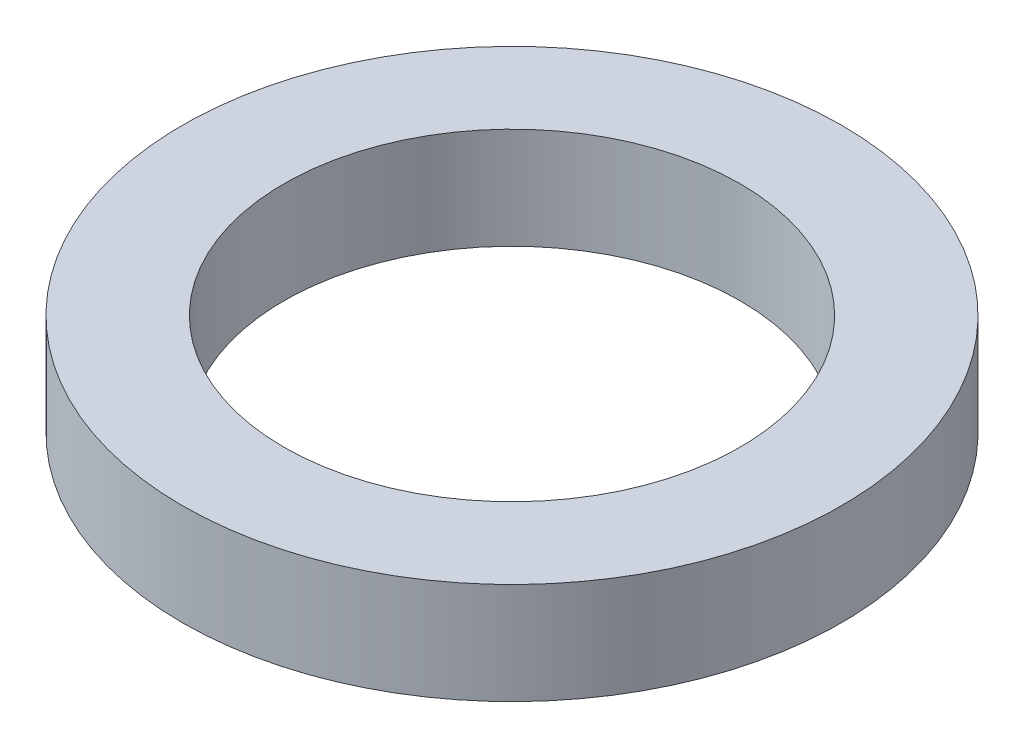
ISO-10303-21;
HEADER;
FILE_DESCRIPTION(('STEP AP214'),'2;1');
FILE_NAME('part.step','',(''),(''),'','','');
FILE_SCHEMA(('AUTOMOTIVE_DESIGN { 1 0 10303 214 1 1 1 1 }'));
ENDSEC;
DATA;
#1=APPLICATION_CONTEXT('core data for automotive mechanical design processes');
#2=APPLICATION_PROTOCOL_DEFINITION('international standard','automotive_design',2000,#1);
#3=PRODUCT_CONTEXT('',#1,'mechanical');
#4=PRODUCT('Part','Part','',(#3));
#5=PRODUCT_RELATED_PRODUCT_CATEGORY('part','',(#4));
#6=PRODUCT_DEFINITION_FORMATION('','',#4);
#7=PRODUCT_DEFINITION_CONTEXT('part definition',#1,'design');
#8=PRODUCT_DEFINITION('design','',#6,#7);
#9=PRODUCT_DEFINITION_SHAPE('','',#8);
#10=(LENGTH_UNIT() NAMED_UNIT(*) SI_UNIT(.MILLI.,.METRE.));
#11=(NAMED_UNIT(*) PLANE_ANGLE_UNIT() SI_UNIT($,.RADIAN.));
#12=(NAMED_UNIT(*) SI_UNIT($,.STERADIAN.) SOLID_ANGLE_UNIT());
#13=UNCERTAINTY_MEASURE_WITH_UNIT(LENGTH_MEASURE(1.E-05),#10,'distance_accuracy_value','');
#14=(GEOMETRIC_REPRESENTATION_CONTEXT(3) GLOBAL_UNCERTAINTY_ASSIGNED_CONTEXT((#13)) GLOBAL_UNIT_ASSIGNED_CONTEXT((#10,
#11,#12)) REPRESENTATION_CONTEXT('',''));
#15=CARTESIAN_POINT('',(0.,0.,0.));
#16=DIRECTION('',(0.,0.,1.));
#17=DIRECTION('',(1.,0.,0.));
#18=AXIS2_PLACEMENT_3D('',#15,#16,#17);
#19=CARTESIAN_POINT('',(0.,1.,0.));
#20=DIRECTION('',(0.,1.,0.));
#21=DIRECTION('',(0.,0.,1.));
#22=AXIS2_PLACEMENT_3D('',#19,#20,#21);
#23=PLANE('',#22);
#24=CARTESIAN_POINT('',(0.,1.,0.));
#25=DIRECTION('',(0.,1.,0.));
#26=DIRECTION('',(0.,0.,1.));
#27=AXIS2_PLACEMENT_3D('',#24,#25,#26);
#28=CIRCLE('',#27,3.25);
#29=CARTESIAN_POINT('',(0.,1.,3.25));
#30=VERTEX_POINT('',#29);
#31=EDGE_CURVE('E10',#30,#30,#28,.T.);
#32=ORIENTED_EDGE('',*,*,#31,.T.);
#33=EDGE_LOOP('',(#32));
#34=FACE_BOUND('',#33,.T.);
#35=CARTESIAN_POINT('',(0.,1.,0.));
#36=DIRECTION('',(0.,1.,0.));
#37=DIRECTION('',(0.,0.,1.));
#38=AXIS2_PLACEMENT_3D('',#35,#36,#37);
#39=CIRCLE('',#38,2.25);
#40=CARTESIAN_POINT('',(0.,1.,2.25));
#41=VERTEX_POINT('',#40);
#42=EDGE_CURVE('E52',#41,#41,#39,.T.);
#43=ORIENTED_EDGE('',*,*,#42,.F.);
#44=EDGE_LOOP('',(#43));
#45=FACE_BOUND('',#44,.T.);
#46=ADVANCED_FACE('F41',(#34,#45),#23,.T.);
#47=CARTESIAN_POINT('',(0.,0.,0.));
#48=DIRECTION('',(0.,1.,0.));
#49=DIRECTION('',(0.,0.,1.));
#50=AXIS2_PLACEMENT_3D('',#47,#48,#49);
#51=PLANE('',#50);
#52=CARTESIAN_POINT('',(0.,0.,0.));
#53=DIRECTION('',(0.,1.,0.));
#54=DIRECTION('',(0.,0.,1.));
#55=AXIS2_PLACEMENT_3D('',#52,#53,#54);
#56=CIRCLE('',#55,3.25);
#57=CARTESIAN_POINT('',(0.,0.,3.25));
#58=VERTEX_POINT('',#57);
#59=EDGE_CURVE('E45',#58,#58,#56,.T.);
#60=ORIENTED_EDGE('',*,*,#59,.F.);
#61=EDGE_LOOP('',(#60));
#62=FACE_BOUND('',#61,.T.);
#63=CARTESIAN_POINT('',(0.,0.,0.));
#64=DIRECTION('',(0.,1.,0.));
#65=DIRECTION('',(0.,0.,1.));
#66=AXIS2_PLACEMENT_3D('',#63,#64,#65);
#67=CIRCLE('',#66,2.25);
#68=CARTESIAN_POINT('',(0.,0.,2.25));
#69=VERTEX_POINT('',#68);
#70=EDGE_CURVE('E54',#69,#69,#67,.T.);
#71=ORIENTED_EDGE('',*,*,#70,.T.);
#72=EDGE_LOOP('',(#71));
#73=FACE_BOUND('',#72,.T.);
#74=ADVANCED_FACE('F64',(#62,#73),#51,.F.);
#75=CARTESIAN_POINT('',(0.,1.,0.));
#76=DIRECTION('',(0.,-1.,0.));
#77=DIRECTION('',(0.,0.,-1.));
#78=AXIS2_PLACEMENT_3D('',#75,#76,#77);
#79=CYLINDRICAL_SURFACE('',#78,3.25);
#80=ORIENTED_EDGE('',*,*,#31,.F.);
#81=EDGE_LOOP('',(#80));
#82=FACE_BOUND('',#81,.T.);
#83=ORIENTED_EDGE('',*,*,#59,.T.);
#84=EDGE_LOOP('',(#83));
#85=FACE_BOUND('',#84,.T.);
#86=ADVANCED_FACE('F43',(#82,#85),#79,.T.);
#87=CARTESIAN_POINT('',(0.,1.,0.));
#88=DIRECTION('',(0.,-1.,0.));
#89=DIRECTION('',(0.,0.,-1.));
#90=AXIS2_PLACEMENT_3D('',#87,#88,#89);
#91=CYLINDRICAL_SURFACE('',#90,2.25);
#92=ORIENTED_EDGE('',*,*,#42,.T.);
#93=EDGE_LOOP('',(#92));
#94=FACE_BOUND('',#93,.T.);
#95=ORIENTED_EDGE('',*,*,#70,.F.);
#96=EDGE_LOOP('',(#95));
#97=FACE_BOUND('',#96,.T.);
#98=ADVANCED_FACE('F60',(#94,#97),#91,.F.);
#99=CLOSED_SHELL('',(#46,#74,#86,#98));
#100=MANIFOLD_SOLID_BREP('B2',#99);
#101=ADVANCED_BREP_SHAPE_REPRESENTATION('',(#18,#100),#14);
#102=SHAPE_DEFINITION_REPRESENTATION(#9,#101);
ENDSEC;
END-ISO-10303-21;
